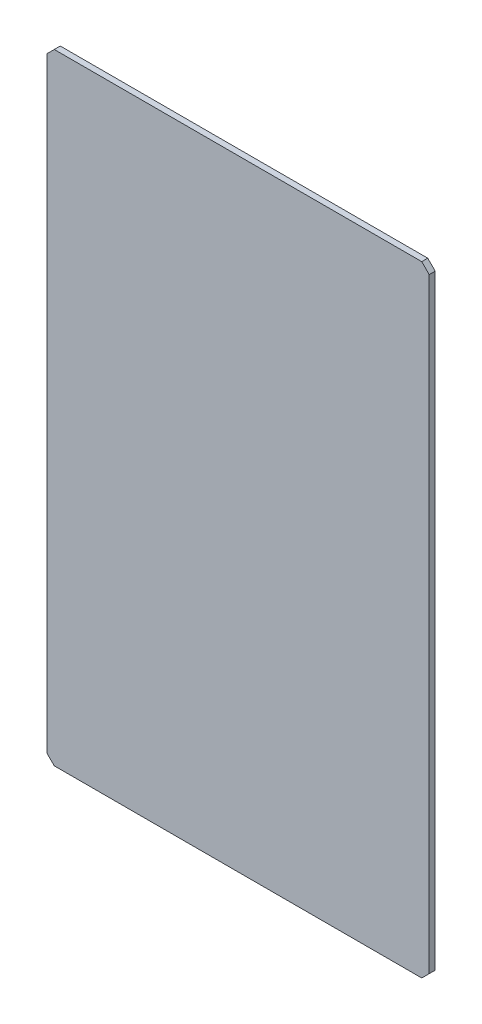
ISO-10303-21;
HEADER;
FILE_DESCRIPTION(('STEP AP214'),'2;1');
FILE_NAME('part.step','',(''),(''),'','','');
FILE_SCHEMA(('AUTOMOTIVE_DESIGN { 1 0 10303 214 1 1 1 1 }'));
ENDSEC;
DATA;
#1=APPLICATION_CONTEXT('core data for automotive mechanical design processes');
#2=APPLICATION_PROTOCOL_DEFINITION('international standard','automotive_design',2000,#1);
#3=PRODUCT_CONTEXT('',#1,'mechanical');
#4=PRODUCT('Part','Part','',(#3));
#5=PRODUCT_RELATED_PRODUCT_CATEGORY('part','',(#4));
#6=PRODUCT_DEFINITION_FORMATION('','',#4);
#7=PRODUCT_DEFINITION_CONTEXT('part definition',#1,'design');
#8=PRODUCT_DEFINITION('design','',#6,#7);
#9=PRODUCT_DEFINITION_SHAPE('','',#8);
#10=(LENGTH_UNIT() NAMED_UNIT(*) SI_UNIT(.MILLI.,.METRE.));
#11=(NAMED_UNIT(*) PLANE_ANGLE_UNIT() SI_UNIT($,.RADIAN.));
#12=(NAMED_UNIT(*) SI_UNIT($,.STERADIAN.) SOLID_ANGLE_UNIT());
#13=UNCERTAINTY_MEASURE_WITH_UNIT(LENGTH_MEASURE(1.E-05),#10,'distance_accuracy_value','');
#14=(GEOMETRIC_REPRESENTATION_CONTEXT(3) GLOBAL_UNCERTAINTY_ASSIGNED_CONTEXT((#13)) GLOBAL_UNIT_ASSIGNED_CONTEXT((#10,
#11,#12)) REPRESENTATION_CONTEXT('',''));
#15=CARTESIAN_POINT('',(0.,0.,0.));
#16=DIRECTION('',(0.,0.,1.));
#17=DIRECTION('',(1.,0.,0.));
#18=AXIS2_PLACEMENT_3D('',#15,#16,#17);
#19=CARTESIAN_POINT('',(48.2004047680435,98.6730587688089,1.2));
#20=DIRECTION('',(-1.,0.,0.));
#21=DIRECTION('',(0.,-1.,0.));
#22=AXIS2_PLACEMENT_3D('',#19,#20,#21);
#23=PLANE('',#22);
#24=DIRECTION('',(0.,1.,0.));
#25=VECTOR('',#24,1.);
#26=CARTESIAN_POINT('',(48.2004047680435,98.6730587688089,0.));
#27=LINE('',#26,#25);
#28=CARTESIAN_POINT('',(48.2004047680435,-23.914429894717,0.));
#29=VERTEX_POINT('',#28);
#30=CARTESIAN_POINT('',(48.2004047680435,97.1730587688089,0.));
#31=VERTEX_POINT('',#30);
#32=EDGE_CURVE('E130',#29,#31,#27,.T.);
#33=ORIENTED_EDGE('',*,*,#32,.T.);
#34=DIRECTION('',(0.,0.,1.));
#35=VECTOR('',#34,1.);
#36=CARTESIAN_POINT('',(48.2004047680435,97.1730587688089,1.2));
#37=LINE('',#36,#35);
#38=CARTESIAN_POINT('',(48.2004047680435,97.1730587688089,1.2));
#39=VERTEX_POINT('',#38);
#40=EDGE_CURVE('E108',#31,#39,#37,.T.);
#41=ORIENTED_EDGE('',*,*,#40,.T.);
#42=DIRECTION('',(0.,1.,0.));
#43=VECTOR('',#42,1.);
#44=CARTESIAN_POINT('',(48.2004047680435,98.6730587688089,1.2));
#45=LINE('',#44,#43);
#46=CARTESIAN_POINT('',(48.2004047680435,-23.914429894717,1.2));
#47=VERTEX_POINT('',#46);
#48=EDGE_CURVE('E139',#47,#39,#45,.T.);
#49=ORIENTED_EDGE('',*,*,#48,.F.);
#50=DIRECTION('',(0.,0.,-1.));
#51=VECTOR('',#50,1.);
#52=CARTESIAN_POINT('',(48.2004047680435,-23.914429894717,1.2));
#53=LINE('',#52,#51);
#54=EDGE_CURVE('E113',#47,#29,#53,.T.);
#55=ORIENTED_EDGE('',*,*,#54,.T.);
#56=EDGE_LOOP('',(#33,#41,#49,#55));
#57=FACE_BOUND('',#56,.T.);
#58=ADVANCED_FACE('F36',(#57),#23,.F.);
#59=CARTESIAN_POINT('',(-28.2995952319565,98.6730587688089,1.2));
#60=DIRECTION('',(0.,-1.,0.));
#61=DIRECTION('',(0.,0.,-1.));
#62=AXIS2_PLACEMENT_3D('',#59,#60,#61);
#63=PLANE('',#62);
#64=DIRECTION('',(-1.,0.,0.));
#65=VECTOR('',#64,1.);
#66=CARTESIAN_POINT('',(-28.2995952319565,98.6730587688089,1.2));
#67=LINE('',#66,#65);
#68=CARTESIAN_POINT('',(46.7004047680435,98.6730587688089,1.2));
#69=VERTEX_POINT('',#68);
#70=CARTESIAN_POINT('',(-26.7995952319565,98.6730587688089,1.2));
#71=VERTEX_POINT('',#70);
#72=EDGE_CURVE('E123',#69,#71,#67,.T.);
#73=ORIENTED_EDGE('',*,*,#72,.F.);
#74=DIRECTION('',(0.,0.,-1.));
#75=VECTOR('',#74,1.);
#76=CARTESIAN_POINT('',(46.7004047680435,98.6730587688089,1.2));
#77=LINE('',#76,#75);
#78=CARTESIAN_POINT('',(46.7004047680435,98.6730587688089,0.));
#79=VERTEX_POINT('',#78);
#80=EDGE_CURVE('E107',#69,#79,#77,.T.);
#81=ORIENTED_EDGE('',*,*,#80,.T.);
#82=DIRECTION('',(-1.,0.,0.));
#83=VECTOR('',#82,1.);
#84=CARTESIAN_POINT('',(-28.2995952319565,98.6730587688089,0.));
#85=LINE('',#84,#83);
#86=CARTESIAN_POINT('',(-26.7995952319565,98.6730587688089,0.));
#87=VERTEX_POINT('',#86);
#88=EDGE_CURVE('E120',#79,#87,#85,.T.);
#89=ORIENTED_EDGE('',*,*,#88,.T.);
#90=DIRECTION('',(0.,0.,1.));
#91=VECTOR('',#90,1.);
#92=CARTESIAN_POINT('',(-26.7995952319565,98.6730587688089,1.2));
#93=LINE('',#92,#91);
#94=EDGE_CURVE('E125',#87,#71,#93,.T.);
#95=ORIENTED_EDGE('',*,*,#94,.T.);
#96=EDGE_LOOP('',(#73,#81,#89,#95));
#97=FACE_BOUND('',#96,.T.);
#98=ADVANCED_FACE('F119',(#97),#63,.F.);
#99=CARTESIAN_POINT('',(-28.2995952319565,98.6730587688089,1.2));
#100=DIRECTION('',(1.,0.,0.));
#101=DIRECTION('',(0.,1.,0.));
#102=AXIS2_PLACEMENT_3D('',#99,#100,#101);
#103=PLANE('',#102);
#104=DIRECTION('',(0.,-1.,0.));
#105=VECTOR('',#104,1.);
#106=CARTESIAN_POINT('',(-28.2995952319565,98.6730587688089,1.2));
#107=LINE('',#106,#105);
#108=CARTESIAN_POINT('',(-28.2995952319565,97.173058768809,1.2));
#109=VERTEX_POINT('',#108);
#110=CARTESIAN_POINT('',(-28.2995952319565,-23.914429894717,1.2));
#111=VERTEX_POINT('',#110);
#112=EDGE_CURVE('E165',#109,#111,#107,.T.);
#113=ORIENTED_EDGE('',*,*,#112,.F.);
#114=DIRECTION('',(0.,0.,-1.));
#115=VECTOR('',#114,1.);
#116=CARTESIAN_POINT('',(-28.2995952319565,97.173058768809,1.2));
#117=LINE('',#116,#115);
#118=CARTESIAN_POINT('',(-28.2995952319565,97.173058768809,0.));
#119=VERTEX_POINT('',#118);
#120=EDGE_CURVE('E158',#109,#119,#117,.T.);
#121=ORIENTED_EDGE('',*,*,#120,.T.);
#122=DIRECTION('',(0.,-1.,0.));
#123=VECTOR('',#122,1.);
#124=CARTESIAN_POINT('',(-28.2995952319565,98.6730587688089,0.));
#125=LINE('',#124,#123);
#126=CARTESIAN_POINT('',(-28.2995952319565,-23.914429894717,0.));
#127=VERTEX_POINT('',#126);
#128=EDGE_CURVE('E129',#119,#127,#125,.T.);
#129=ORIENTED_EDGE('',*,*,#128,.T.);
#130=DIRECTION('',(0.,0.,1.));
#131=VECTOR('',#130,1.);
#132=CARTESIAN_POINT('',(-28.2995952319565,-23.914429894717,1.2));
#133=LINE('',#132,#131);
#134=EDGE_CURVE('E156',#127,#111,#133,.T.);
#135=ORIENTED_EDGE('',*,*,#134,.T.);
#136=EDGE_LOOP('',(#113,#121,#129,#135));
#137=FACE_BOUND('',#136,.T.);
#138=ADVANCED_FACE('F163',(#137),#103,.F.);
#139=CARTESIAN_POINT('',(-28.2995952319565,-25.414429894717,1.2));
#140=DIRECTION('',(0.,1.,0.));
#141=DIRECTION('',(0.,0.,1.));
#142=AXIS2_PLACEMENT_3D('',#139,#140,#141);
#143=PLANE('',#142);
#144=DIRECTION('',(1.,0.,0.));
#145=VECTOR('',#144,1.);
#146=CARTESIAN_POINT('',(-28.2995952319565,-25.414429894717,1.2));
#147=LINE('',#146,#145);
#148=CARTESIAN_POINT('',(-26.7995952319565,-25.414429894717,1.2));
#149=VERTEX_POINT('',#148);
#150=CARTESIAN_POINT('',(46.7004047680435,-25.414429894717,1.2));
#151=VERTEX_POINT('',#150);
#152=EDGE_CURVE('E140',#149,#151,#147,.T.);
#153=ORIENTED_EDGE('',*,*,#152,.F.);
#154=DIRECTION('',(0.,0.,-1.));
#155=VECTOR('',#154,1.);
#156=CARTESIAN_POINT('',(-26.7995952319565,-25.414429894717,1.2));
#157=LINE('',#156,#155);
#158=CARTESIAN_POINT('',(-26.7995952319565,-25.414429894717,0.));
#159=VERTEX_POINT('',#158);
#160=EDGE_CURVE('E11',#149,#159,#157,.T.);
#161=ORIENTED_EDGE('',*,*,#160,.T.);
#162=DIRECTION('',(1.,0.,0.));
#163=VECTOR('',#162,1.);
#164=CARTESIAN_POINT('',(-28.2995952319565,-25.414429894717,0.));
#165=LINE('',#164,#163);
#166=CARTESIAN_POINT('',(46.7004047680435,-25.414429894717,0.));
#167=VERTEX_POINT('',#166);
#168=EDGE_CURVE('E133',#159,#167,#165,.T.);
#169=ORIENTED_EDGE('',*,*,#168,.T.);
#170=DIRECTION('',(0.,0.,1.));
#171=VECTOR('',#170,1.);
#172=CARTESIAN_POINT('',(46.7004047680435,-25.414429894717,1.2));
#173=LINE('',#172,#171);
#174=EDGE_CURVE('E45',#167,#151,#173,.T.);
#175=ORIENTED_EDGE('',*,*,#174,.T.);
#176=EDGE_LOOP('',(#153,#161,#169,#175));
#177=FACE_BOUND('',#176,.T.);
#178=ADVANCED_FACE('F172',(#177),#143,.F.);
#179=CARTESIAN_POINT('',(0.,0.,1.2));
#180=DIRECTION('',(0.,0.,1.));
#181=DIRECTION('',(1.,0.,0.));
#182=AXIS2_PLACEMENT_3D('',#179,#180,#181);
#183=PLANE('',#182);
#184=ORIENTED_EDGE('',*,*,#48,.T.);
#185=DIRECTION('',(0.707106781186548,-0.707106781186548,0.));
#186=VECTOR('',#185,1.);
#187=CARTESIAN_POINT('',(72.6867317684262,72.6867317684262,1.2));
#188=LINE('',#187,#186);
#189=EDGE_CURVE('E154',#39,#69,#188,.F.);
#190=ORIENTED_EDGE('',*,*,#189,.T.);
#191=ORIENTED_EDGE('',*,*,#72,.T.);
#192=DIRECTION('',(0.707106781186548,0.707106781186548,0.));
#193=VECTOR('',#192,1.);
#194=CARTESIAN_POINT('',(-62.7363270003827,62.7363270003827,1.2));
#195=LINE('',#194,#193);
#196=EDGE_CURVE('E152',#71,#109,#195,.F.);
#197=ORIENTED_EDGE('',*,*,#196,.T.);
#198=ORIENTED_EDGE('',*,*,#112,.T.);
#199=DIRECTION('',(-0.707106781186544,0.707106781186551,0.));
#200=VECTOR('',#199,1.);
#201=CARTESIAN_POINT('',(-26.1070125633369,-26.1070125633366,1.2));
#202=LINE('',#201,#200);
#203=EDGE_CURVE('E58',#111,#149,#202,.F.);
#204=ORIENTED_EDGE('',*,*,#203,.T.);
#205=ORIENTED_EDGE('',*,*,#152,.T.);
#206=DIRECTION('',(-0.707106781186548,-0.707106781186548,0.));
#207=VECTOR('',#206,1.);
#208=CARTESIAN_POINT('',(36.0574173313802,-36.0574173313802,1.2));
#209=LINE('',#208,#207);
#210=EDGE_CURVE('E149',#151,#47,#209,.F.);
#211=ORIENTED_EDGE('',*,*,#210,.T.);
#212=EDGE_LOOP('',(#184,#190,#191,#197,#198,#204,#205,#211));
#213=FACE_BOUND('',#212,.T.);
#214=ADVANCED_FACE('F179',(#213),#183,.T.);
#215=CARTESIAN_POINT('',(0.,0.,0.));
#216=DIRECTION('',(0.,0.,1.));
#217=DIRECTION('',(1.,0.,0.));
#218=AXIS2_PLACEMENT_3D('',#215,#216,#217);
#219=PLANE('',#218);
#220=ORIENTED_EDGE('',*,*,#88,.F.);
#221=DIRECTION('',(-0.707106781186548,0.707106781186548,0.));
#222=VECTOR('',#221,1.);
#223=CARTESIAN_POINT('',(46.7004047680435,98.6730587688089,0.));
#224=LINE('',#223,#222);
#225=EDGE_CURVE('E103',#79,#31,#224,.F.);
#226=ORIENTED_EDGE('',*,*,#225,.T.);
#227=ORIENTED_EDGE('',*,*,#32,.F.);
#228=DIRECTION('',(0.707106781186548,0.707106781186548,0.));
#229=VECTOR('',#228,1.);
#230=CARTESIAN_POINT('',(48.2004047680435,-23.914429894717,0.));
#231=LINE('',#230,#229);
#232=EDGE_CURVE('E124',#29,#167,#231,.F.);
#233=ORIENTED_EDGE('',*,*,#232,.T.);
#234=ORIENTED_EDGE('',*,*,#168,.F.);
#235=DIRECTION('',(0.707106781186544,-0.707106781186551,0.));
#236=VECTOR('',#235,1.);
#237=CARTESIAN_POINT('',(-26.7995952319565,-25.414429894717,0.));
#238=LINE('',#237,#236);
#239=EDGE_CURVE('E143',#159,#127,#238,.F.);
#240=ORIENTED_EDGE('',*,*,#239,.T.);
#241=ORIENTED_EDGE('',*,*,#128,.F.);
#242=DIRECTION('',(-0.707106781186548,-0.707106781186548,0.));
#243=VECTOR('',#242,1.);
#244=CARTESIAN_POINT('',(-28.2995952319565,97.173058768809,0.));
#245=LINE('',#244,#243);
#246=EDGE_CURVE('E114',#119,#87,#245,.F.);
#247=ORIENTED_EDGE('',*,*,#246,.T.);
#248=EDGE_LOOP('',(#220,#226,#227,#233,#234,#240,#241,#247));
#249=FACE_BOUND('',#248,.T.);
#250=ADVANCED_FACE('F127',(#249),#219,.F.);
#251=CARTESIAN_POINT('',(46.7004047680435,98.6730587688089,1.2));
#252=DIRECTION('',(-0.707106781186547,-0.707106781186547,0.));
#253=DIRECTION('',(0.,0.,-1.));
#254=AXIS2_PLACEMENT_3D('',#251,#252,#253);
#255=PLANE('',#254);
#256=ORIENTED_EDGE('',*,*,#189,.F.);
#257=ORIENTED_EDGE('',*,*,#40,.F.);
#258=ORIENTED_EDGE('',*,*,#225,.F.);
#259=ORIENTED_EDGE('',*,*,#80,.F.);
#260=EDGE_LOOP('',(#256,#257,#258,#259));
#261=FACE_BOUND('',#260,.T.);
#262=ADVANCED_FACE('F106',(#261),#255,.F.);
#263=CARTESIAN_POINT('',(-28.2995952319565,97.173058768809,1.2));
#264=DIRECTION('',(0.707106781186548,-0.707106781186548,0.));
#265=DIRECTION('',(0.,0.,-1.));
#266=AXIS2_PLACEMENT_3D('',#263,#264,#265);
#267=PLANE('',#266);
#268=ORIENTED_EDGE('',*,*,#196,.F.);
#269=ORIENTED_EDGE('',*,*,#94,.F.);
#270=ORIENTED_EDGE('',*,*,#246,.F.);
#271=ORIENTED_EDGE('',*,*,#120,.F.);
#272=EDGE_LOOP('',(#268,#269,#270,#271));
#273=FACE_BOUND('',#272,.T.);
#274=ADVANCED_FACE('F187',(#273),#267,.F.);
#275=CARTESIAN_POINT('',(-26.7995952319565,-25.414429894717,1.2));
#276=DIRECTION('',(0.707106781186551,0.707106781186544,0.));
#277=DIRECTION('',(0.,0.,-1.));
#278=AXIS2_PLACEMENT_3D('',#275,#276,#277);
#279=PLANE('',#278);
#280=ORIENTED_EDGE('',*,*,#203,.F.);
#281=ORIENTED_EDGE('',*,*,#134,.F.);
#282=ORIENTED_EDGE('',*,*,#239,.F.);
#283=ORIENTED_EDGE('',*,*,#160,.F.);
#284=EDGE_LOOP('',(#280,#281,#282,#283));
#285=FACE_BOUND('',#284,.T.);
#286=ADVANCED_FACE('F171',(#285),#279,.F.);
#287=CARTESIAN_POINT('',(48.2004047680435,-23.914429894717,1.2));
#288=DIRECTION('',(-0.707106781186547,0.707106781186547,0.));
#289=DIRECTION('',(0.,0.,-1.));
#290=AXIS2_PLACEMENT_3D('',#287,#288,#289);
#291=PLANE('',#290);
#292=ORIENTED_EDGE('',*,*,#210,.F.);
#293=ORIENTED_EDGE('',*,*,#174,.F.);
#294=ORIENTED_EDGE('',*,*,#232,.F.);
#295=ORIENTED_EDGE('',*,*,#54,.F.);
#296=EDGE_LOOP('',(#292,#293,#294,#295));
#297=FACE_BOUND('',#296,.T.);
#298=ADVANCED_FACE('F39',(#297),#291,.F.);
#299=CLOSED_SHELL('',(#58,#98,#138,#178,#214,#250,#262,#274,#286,#298));
#300=MANIFOLD_SOLID_BREP('B2',#299);
#301=ADVANCED_BREP_SHAPE_REPRESENTATION('',(#18,#300),#14);
#302=SHAPE_DEFINITION_REPRESENTATION(#9,#301);
ENDSEC;
END-ISO-10303-21;
